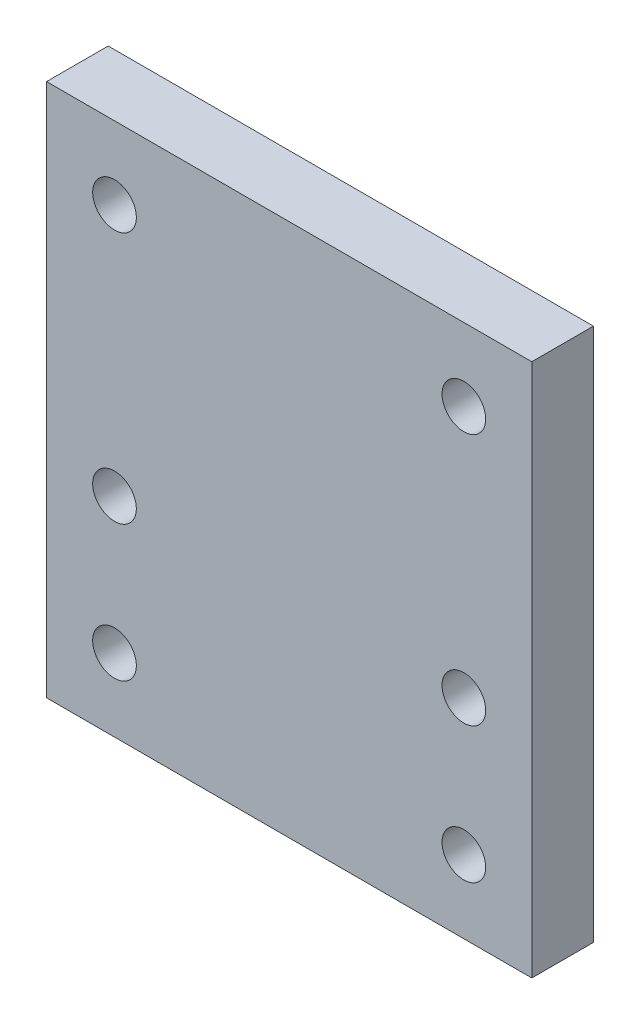
ISO-10303-21;
HEADER;
FILE_DESCRIPTION(('STEP AP214'),'2;1');
FILE_NAME('part.step','',(''),(''),'','','');
FILE_SCHEMA(('AUTOMOTIVE_DESIGN { 1 0 10303 214 1 1 1 1 }'));
ENDSEC;
DATA;
#1=APPLICATION_CONTEXT('core data for automotive mechanical design processes');
#2=APPLICATION_PROTOCOL_DEFINITION('international standard','automotive_design',2000,#1);
#3=PRODUCT_CONTEXT('',#1,'mechanical');
#4=PRODUCT('Part','Part','',(#3));
#5=PRODUCT_RELATED_PRODUCT_CATEGORY('part','',(#4));
#6=PRODUCT_DEFINITION_FORMATION('','',#4);
#7=PRODUCT_DEFINITION_CONTEXT('part definition',#1,'design');
#8=PRODUCT_DEFINITION('design','',#6,#7);
#9=PRODUCT_DEFINITION_SHAPE('','',#8);
#10=(LENGTH_UNIT() NAMED_UNIT(*) SI_UNIT(.MILLI.,.METRE.));
#11=(NAMED_UNIT(*) PLANE_ANGLE_UNIT() SI_UNIT($,.RADIAN.));
#12=(NAMED_UNIT(*) SI_UNIT($,.STERADIAN.) SOLID_ANGLE_UNIT());
#13=UNCERTAINTY_MEASURE_WITH_UNIT(LENGTH_MEASURE(1.E-05),#10,'distance_accuracy_value','');
#14=(GEOMETRIC_REPRESENTATION_CONTEXT(3) GLOBAL_UNCERTAINTY_ASSIGNED_CONTEXT((#13)) GLOBAL_UNIT_ASSIGNED_CONTEXT((#10,
#11,#12)) REPRESENTATION_CONTEXT('',''));
#15=CARTESIAN_POINT('',(0.,0.,0.));
#16=DIRECTION('',(0.,0.,1.));
#17=DIRECTION('',(1.,0.,0.));
#18=AXIS2_PLACEMENT_3D('',#15,#16,#17);
#19=CARTESIAN_POINT('',(0.,0.,12.7));
#20=DIRECTION('',(1.,0.,0.));
#21=DIRECTION('',(0.,0.,-1.));
#22=AXIS2_PLACEMENT_3D('',#19,#20,#21);
#23=PLANE('',#22);
#24=DIRECTION('',(0.,-1.,0.));
#25=VECTOR('',#24,1.);
#26=CARTESIAN_POINT('',(0.,0.,0.));
#27=LINE('',#26,#25);
#28=CARTESIAN_POINT('',(0.,110.,0.));
#29=VERTEX_POINT('',#28);
#30=CARTESIAN_POINT('',(0.,0.,0.));
#31=VERTEX_POINT('',#30);
#32=EDGE_CURVE('E99',#29,#31,#27,.T.);
#33=ORIENTED_EDGE('',*,*,#32,.T.);
#34=DIRECTION('',(0.,0.,-1.));
#35=VECTOR('',#34,1.);
#36=CARTESIAN_POINT('',(0.,0.,12.7));
#37=LINE('',#36,#35);
#38=CARTESIAN_POINT('',(0.,0.,12.7));
#39=VERTEX_POINT('',#38);
#40=EDGE_CURVE('E11',#39,#31,#37,.T.);
#41=ORIENTED_EDGE('',*,*,#40,.F.);
#42=DIRECTION('',(0.,-1.,0.));
#43=VECTOR('',#42,1.);
#44=CARTESIAN_POINT('',(0.,0.,12.7));
#45=LINE('',#44,#43);
#46=CARTESIAN_POINT('',(0.,110.,12.7));
#47=VERTEX_POINT('',#46);
#48=EDGE_CURVE('E87',#47,#39,#45,.T.);
#49=ORIENTED_EDGE('',*,*,#48,.F.);
#50=DIRECTION('',(0.,0.,-1.));
#51=VECTOR('',#50,1.);
#52=CARTESIAN_POINT('',(0.,110.,12.7));
#53=LINE('',#52,#51);
#54=EDGE_CURVE('E95',#47,#29,#53,.T.);
#55=ORIENTED_EDGE('',*,*,#54,.T.);
#56=EDGE_LOOP('',(#33,#41,#49,#55));
#57=FACE_BOUND('',#56,.T.);
#58=ADVANCED_FACE('F36',(#57),#23,.F.);
#59=CARTESIAN_POINT('',(0.,0.,12.7));
#60=DIRECTION('',(0.,1.,0.));
#61=DIRECTION('',(0.,0.,1.));
#62=AXIS2_PLACEMENT_3D('',#59,#60,#61);
#63=PLANE('',#62);
#64=DIRECTION('',(1.,0.,0.));
#65=VECTOR('',#64,1.);
#66=CARTESIAN_POINT('',(0.,0.,0.));
#67=LINE('',#66,#65);
#68=CARTESIAN_POINT('',(100.,0.,0.));
#69=VERTEX_POINT('',#68);
#70=EDGE_CURVE('E91',#31,#69,#67,.T.);
#71=ORIENTED_EDGE('',*,*,#70,.T.);
#72=DIRECTION('',(0.,0.,-1.));
#73=VECTOR('',#72,1.);
#74=CARTESIAN_POINT('',(100.,0.,12.7));
#75=LINE('',#74,#73);
#76=CARTESIAN_POINT('',(100.,0.,12.7));
#77=VERTEX_POINT('',#76);
#78=EDGE_CURVE('E44',#77,#69,#75,.T.);
#79=ORIENTED_EDGE('',*,*,#78,.F.);
#80=DIRECTION('',(1.,0.,0.));
#81=VECTOR('',#80,1.);
#82=CARTESIAN_POINT('',(0.,0.,12.7));
#83=LINE('',#82,#81);
#84=EDGE_CURVE('E82',#39,#77,#83,.T.);
#85=ORIENTED_EDGE('',*,*,#84,.F.);
#86=ORIENTED_EDGE('',*,*,#40,.T.);
#87=EDGE_LOOP('',(#71,#79,#85,#86));
#88=FACE_BOUND('',#87,.T.);
#89=ADVANCED_FACE('F90',(#88),#63,.F.);
#90=CARTESIAN_POINT('',(100.,0.,12.7));
#91=DIRECTION('',(-1.,0.,0.));
#92=DIRECTION('',(0.,0.,1.));
#93=AXIS2_PLACEMENT_3D('',#90,#91,#92);
#94=PLANE('',#93);
#95=DIRECTION('',(0.,1.,0.));
#96=VECTOR('',#95,1.);
#97=CARTESIAN_POINT('',(100.,0.,0.));
#98=LINE('',#97,#96);
#99=CARTESIAN_POINT('',(100.,110.,0.));
#100=VERTEX_POINT('',#99);
#101=EDGE_CURVE('E69',#69,#100,#98,.T.);
#102=ORIENTED_EDGE('',*,*,#101,.T.);
#103=DIRECTION('',(0.,0.,-1.));
#104=VECTOR('',#103,1.);
#105=CARTESIAN_POINT('',(100.,110.,12.7));
#106=LINE('',#105,#104);
#107=CARTESIAN_POINT('',(100.,110.,12.7));
#108=VERTEX_POINT('',#107);
#109=EDGE_CURVE('E92',#108,#100,#106,.T.);
#110=ORIENTED_EDGE('',*,*,#109,.F.);
#111=DIRECTION('',(0.,1.,0.));
#112=VECTOR('',#111,1.);
#113=CARTESIAN_POINT('',(100.,0.,12.7));
#114=LINE('',#113,#112);
#115=EDGE_CURVE('E85',#77,#108,#114,.T.);
#116=ORIENTED_EDGE('',*,*,#115,.F.);
#117=ORIENTED_EDGE('',*,*,#78,.T.);
#118=EDGE_LOOP('',(#102,#110,#116,#117));
#119=FACE_BOUND('',#118,.T.);
#120=ADVANCED_FACE('F93',(#119),#94,.F.);
#121=CARTESIAN_POINT('',(0.,110.,12.7));
#122=DIRECTION('',(0.,-1.,0.));
#123=DIRECTION('',(0.,0.,-1.));
#124=AXIS2_PLACEMENT_3D('',#121,#122,#123);
#125=PLANE('',#124);
#126=DIRECTION('',(-1.,0.,0.));
#127=VECTOR('',#126,1.);
#128=CARTESIAN_POINT('',(0.,110.,0.));
#129=LINE('',#128,#127);
#130=EDGE_CURVE('E75',#100,#29,#129,.T.);
#131=ORIENTED_EDGE('',*,*,#130,.T.);
#132=ORIENTED_EDGE('',*,*,#54,.F.);
#133=DIRECTION('',(-1.,0.,0.));
#134=VECTOR('',#133,1.);
#135=CARTESIAN_POINT('',(0.,110.,12.7));
#136=LINE('',#135,#134);
#137=EDGE_CURVE('E52',#108,#47,#136,.T.);
#138=ORIENTED_EDGE('',*,*,#137,.F.);
#139=ORIENTED_EDGE('',*,*,#109,.T.);
#140=EDGE_LOOP('',(#131,#132,#138,#139));
#141=FACE_BOUND('',#140,.T.);
#142=ADVANCED_FACE('F107',(#141),#125,.F.);
#143=CARTESIAN_POINT('',(0.,0.,12.7));
#144=DIRECTION('',(0.,0.,-1.));
#145=DIRECTION('',(-1.,0.,0.));
#146=AXIS2_PLACEMENT_3D('',#143,#144,#145);
#147=PLANE('',#146);
#148=CARTESIAN_POINT('',(86.0000000000001,94.9999999999999,12.7));
#149=DIRECTION('',(0.,0.,1.));
#150=DIRECTION('',(1.,0.,0.));
#151=AXIS2_PLACEMENT_3D('',#148,#149,#150);
#152=CIRCLE('',#151,4.50000000000002);
#153=CARTESIAN_POINT('',(90.5000000000001,94.9999999999999,12.7));
#154=VERTEX_POINT('',#153);
#155=EDGE_CURVE('E118',#154,#154,#152,.T.);
#156=ORIENTED_EDGE('',*,*,#155,.F.);
#157=EDGE_LOOP('',(#156));
#158=FACE_BOUND('',#157,.T.);
#159=CARTESIAN_POINT('',(14.0000000000002,95.,12.7));
#160=DIRECTION('',(0.,0.,1.));
#161=DIRECTION('',(1.,0.,0.));
#162=AXIS2_PLACEMENT_3D('',#159,#160,#161);
#163=CIRCLE('',#162,4.50000000000003);
#164=CARTESIAN_POINT('',(18.5000000000002,95.,12.7));
#165=VERTEX_POINT('',#164);
#166=EDGE_CURVE('E133',#165,#165,#163,.T.);
#167=ORIENTED_EDGE('',*,*,#166,.F.);
#168=EDGE_LOOP('',(#167));
#169=FACE_BOUND('',#168,.T.);
#170=CARTESIAN_POINT('',(14.0000000000001,42.9999999999999,12.7));
#171=DIRECTION('',(0.,0.,1.));
#172=DIRECTION('',(1.,0.,0.));
#173=AXIS2_PLACEMENT_3D('',#170,#171,#172);
#174=CIRCLE('',#173,4.50000000000002);
#175=CARTESIAN_POINT('',(18.5000000000001,42.9999999999999,12.7));
#176=VERTEX_POINT('',#175);
#177=EDGE_CURVE('E127',#176,#176,#174,.T.);
#178=ORIENTED_EDGE('',*,*,#177,.F.);
#179=EDGE_LOOP('',(#178));
#180=FACE_BOUND('',#179,.T.);
#181=CARTESIAN_POINT('',(86.,15.,12.7));
#182=DIRECTION('',(0.,0.,1.));
#183=DIRECTION('',(1.,0.,0.));
#184=AXIS2_PLACEMENT_3D('',#181,#182,#183);
#185=CIRCLE('',#184,4.5);
#186=CARTESIAN_POINT('',(90.5,15.,12.7));
#187=VERTEX_POINT('',#186);
#188=EDGE_CURVE('E119',#187,#187,#185,.T.);
#189=ORIENTED_EDGE('',*,*,#188,.F.);
#190=EDGE_LOOP('',(#189));
#191=FACE_BOUND('',#190,.T.);
#192=CARTESIAN_POINT('',(14.,15.,12.7));
#193=DIRECTION('',(0.,0.,1.));
#194=DIRECTION('',(1.,0.,0.));
#195=AXIS2_PLACEMENT_3D('',#192,#193,#194);
#196=CIRCLE('',#195,4.5);
#197=CARTESIAN_POINT('',(18.5,15.,12.7));
#198=VERTEX_POINT('',#197);
#199=EDGE_CURVE('E126',#198,#198,#196,.T.);
#200=ORIENTED_EDGE('',*,*,#199,.F.);
#201=EDGE_LOOP('',(#200));
#202=FACE_BOUND('',#201,.T.);
#203=CARTESIAN_POINT('',(85.9999999999998,42.9999999999998,12.7));
#204=DIRECTION('',(0.,0.,1.));
#205=DIRECTION('',(1.,0.,0.));
#206=AXIS2_PLACEMENT_3D('',#203,#204,#205);
#207=CIRCLE('',#206,4.49999999999999);
#208=CARTESIAN_POINT('',(90.4999999999998,42.9999999999998,12.7));
#209=VERTEX_POINT('',#208);
#210=EDGE_CURVE('E115',#209,#209,#207,.T.);
#211=ORIENTED_EDGE('',*,*,#210,.F.);
#212=EDGE_LOOP('',(#211));
#213=FACE_BOUND('',#212,.T.);
#214=ORIENTED_EDGE('',*,*,#48,.T.);
#215=ORIENTED_EDGE('',*,*,#84,.T.);
#216=ORIENTED_EDGE('',*,*,#115,.T.);
#217=ORIENTED_EDGE('',*,*,#137,.T.);
#218=EDGE_LOOP('',(#214,#215,#216,#217));
#219=FACE_BOUND('',#218,.T.);
#220=ADVANCED_FACE('F83',(#158,#169,#180,#191,#202,#213,#219),#147,.F.);
#221=CARTESIAN_POINT('',(0.,0.,0.));
#222=DIRECTION('',(0.,0.,-1.));
#223=DIRECTION('',(-1.,0.,0.));
#224=AXIS2_PLACEMENT_3D('',#221,#222,#223);
#225=PLANE('',#224);
#226=CARTESIAN_POINT('',(86.0000000000001,94.9999999999999,0.));
#227=DIRECTION('',(0.,0.,-1.));
#228=DIRECTION('',(-1.,0.,0.));
#229=AXIS2_PLACEMENT_3D('',#226,#227,#228);
#230=CIRCLE('',#229,4.50000000000002);
#231=CARTESIAN_POINT('',(81.5000000000001,94.9999999999999,0.));
#232=VERTEX_POINT('',#231);
#233=EDGE_CURVE('E136',#232,#232,#230,.F.);
#234=ORIENTED_EDGE('',*,*,#233,.T.);
#235=EDGE_LOOP('',(#234));
#236=FACE_BOUND('',#235,.T.);
#237=CARTESIAN_POINT('',(14.0000000000002,95.,0.));
#238=DIRECTION('',(0.,0.,-1.));
#239=DIRECTION('',(-1.,0.,0.));
#240=AXIS2_PLACEMENT_3D('',#237,#238,#239);
#241=CIRCLE('',#240,4.50000000000003);
#242=CARTESIAN_POINT('',(9.50000000000016,95.,0.));
#243=VERTEX_POINT('',#242);
#244=EDGE_CURVE('E130',#243,#243,#241,.F.);
#245=ORIENTED_EDGE('',*,*,#244,.T.);
#246=EDGE_LOOP('',(#245));
#247=FACE_BOUND('',#246,.T.);
#248=CARTESIAN_POINT('',(14.0000000000001,42.9999999999999,0.));
#249=DIRECTION('',(0.,0.,-1.));
#250=DIRECTION('',(-1.,0.,0.));
#251=AXIS2_PLACEMENT_3D('',#248,#249,#250);
#252=CIRCLE('',#251,4.50000000000002);
#253=CARTESIAN_POINT('',(9.50000000000007,42.9999999999999,0.));
#254=VERTEX_POINT('',#253);
#255=EDGE_CURVE('E122',#254,#254,#252,.F.);
#256=ORIENTED_EDGE('',*,*,#255,.T.);
#257=EDGE_LOOP('',(#256));
#258=FACE_BOUND('',#257,.T.);
#259=CARTESIAN_POINT('',(86.,15.,0.));
#260=DIRECTION('',(0.,0.,-1.));
#261=DIRECTION('',(-1.,0.,0.));
#262=AXIS2_PLACEMENT_3D('',#259,#260,#261);
#263=CIRCLE('',#262,4.5);
#264=CARTESIAN_POINT('',(81.5,15.,0.));
#265=VERTEX_POINT('',#264);
#266=EDGE_CURVE('E123',#265,#265,#263,.F.);
#267=ORIENTED_EDGE('',*,*,#266,.T.);
#268=EDGE_LOOP('',(#267));
#269=FACE_BOUND('',#268,.T.);
#270=CARTESIAN_POINT('',(14.,15.,0.));
#271=DIRECTION('',(0.,0.,-1.));
#272=DIRECTION('',(-1.,0.,0.));
#273=AXIS2_PLACEMENT_3D('',#270,#271,#272);
#274=CIRCLE('',#273,4.5);
#275=CARTESIAN_POINT('',(9.5,15.,0.));
#276=VERTEX_POINT('',#275);
#277=EDGE_CURVE('E145',#276,#276,#274,.F.);
#278=ORIENTED_EDGE('',*,*,#277,.T.);
#279=EDGE_LOOP('',(#278));
#280=FACE_BOUND('',#279,.T.);
#281=CARTESIAN_POINT('',(85.9999999999998,42.9999999999998,0.));
#282=DIRECTION('',(0.,0.,-1.));
#283=DIRECTION('',(-1.,0.,0.));
#284=AXIS2_PLACEMENT_3D('',#281,#282,#283);
#285=CIRCLE('',#284,4.49999999999999);
#286=CARTESIAN_POINT('',(81.4999999999998,42.9999999999998,0.));
#287=VERTEX_POINT('',#286);
#288=EDGE_CURVE('E102',#287,#287,#285,.F.);
#289=ORIENTED_EDGE('',*,*,#288,.T.);
#290=EDGE_LOOP('',(#289));
#291=FACE_BOUND('',#290,.T.);
#292=ORIENTED_EDGE('',*,*,#32,.F.);
#293=ORIENTED_EDGE('',*,*,#130,.F.);
#294=ORIENTED_EDGE('',*,*,#101,.F.);
#295=ORIENTED_EDGE('',*,*,#70,.F.);
#296=EDGE_LOOP('',(#292,#293,#294,#295));
#297=FACE_BOUND('',#296,.T.);
#298=ADVANCED_FACE('F110',(#236,#247,#258,#269,#280,#291,#297),#225,.T.);
#299=CARTESIAN_POINT('',(85.9999999999998,42.9999999999998,-12.727922061358));
#300=DIRECTION('',(0.,0.,1.));
#301=DIRECTION('',(1.,0.,0.));
#302=AXIS2_PLACEMENT_3D('',#299,#300,#301);
#303=CYLINDRICAL_SURFACE('',#302,4.49999999999999);
#304=ORIENTED_EDGE('',*,*,#210,.T.);
#305=EDGE_LOOP('',(#304));
#306=FACE_BOUND('',#305,.T.);
#307=ORIENTED_EDGE('',*,*,#288,.F.);
#308=EDGE_LOOP('',(#307));
#309=FACE_BOUND('',#308,.T.);
#310=ADVANCED_FACE('F154',(#306,#309),#303,.F.);
#311=CARTESIAN_POINT('',(14.,15.,-12.727922061358));
#312=DIRECTION('',(0.,0.,1.));
#313=DIRECTION('',(1.,0.,0.));
#314=AXIS2_PLACEMENT_3D('',#311,#312,#313);
#315=CYLINDRICAL_SURFACE('',#314,4.5);
#316=ORIENTED_EDGE('',*,*,#199,.T.);
#317=EDGE_LOOP('',(#316));
#318=FACE_BOUND('',#317,.T.);
#319=ORIENTED_EDGE('',*,*,#277,.F.);
#320=EDGE_LOOP('',(#319));
#321=FACE_BOUND('',#320,.T.);
#322=ADVANCED_FACE('F151',(#318,#321),#315,.F.);
#323=CARTESIAN_POINT('',(86.,15.,-12.727922061358));
#324=DIRECTION('',(0.,0.,1.));
#325=DIRECTION('',(1.,0.,0.));
#326=AXIS2_PLACEMENT_3D('',#323,#324,#325);
#327=CYLINDRICAL_SURFACE('',#326,4.5);
#328=ORIENTED_EDGE('',*,*,#188,.T.);
#329=EDGE_LOOP('',(#328));
#330=FACE_BOUND('',#329,.T.);
#331=ORIENTED_EDGE('',*,*,#266,.F.);
#332=EDGE_LOOP('',(#331));
#333=FACE_BOUND('',#332,.T.);
#334=ADVANCED_FACE('F153',(#330,#333),#327,.F.);
#335=CARTESIAN_POINT('',(14.0000000000001,42.9999999999999,-12.727922061358));
#336=DIRECTION('',(0.,0.,1.));
#337=DIRECTION('',(1.,0.,0.));
#338=AXIS2_PLACEMENT_3D('',#335,#336,#337);
#339=CYLINDRICAL_SURFACE('',#338,4.50000000000002);
#340=ORIENTED_EDGE('',*,*,#177,.T.);
#341=EDGE_LOOP('',(#340));
#342=FACE_BOUND('',#341,.T.);
#343=ORIENTED_EDGE('',*,*,#255,.F.);
#344=EDGE_LOOP('',(#343));
#345=FACE_BOUND('',#344,.T.);
#346=ADVANCED_FACE('F161',(#342,#345),#339,.F.);
#347=CARTESIAN_POINT('',(14.0000000000002,95.,-12.727922061358));
#348=DIRECTION('',(0.,0.,1.));
#349=DIRECTION('',(1.,0.,0.));
#350=AXIS2_PLACEMENT_3D('',#347,#348,#349);
#351=CYLINDRICAL_SURFACE('',#350,4.50000000000003);
#352=ORIENTED_EDGE('',*,*,#166,.T.);
#353=EDGE_LOOP('',(#352));
#354=FACE_BOUND('',#353,.T.);
#355=ORIENTED_EDGE('',*,*,#244,.F.);
#356=EDGE_LOOP('',(#355));
#357=FACE_BOUND('',#356,.T.);
#358=ADVANCED_FACE('F186',(#354,#357),#351,.F.);
#359=CARTESIAN_POINT('',(86.0000000000001,94.9999999999999,-12.727922061358));
#360=DIRECTION('',(0.,0.,1.));
#361=DIRECTION('',(1.,0.,0.));
#362=AXIS2_PLACEMENT_3D('',#359,#360,#361);
#363=CYLINDRICAL_SURFACE('',#362,4.50000000000002);
#364=ORIENTED_EDGE('',*,*,#155,.T.);
#365=EDGE_LOOP('',(#364));
#366=FACE_BOUND('',#365,.T.);
#367=ORIENTED_EDGE('',*,*,#233,.F.);
#368=EDGE_LOOP('',(#367));
#369=FACE_BOUND('',#368,.T.);
#370=ADVANCED_FACE('F189',(#366,#369),#363,.F.);
#371=CLOSED_SHELL('',(#58,#89,#120,#142,#220,#298,#310,#322,#334,#346,#358,#370));
#372=MANIFOLD_SOLID_BREP('B2',#371);
#373=ADVANCED_BREP_SHAPE_REPRESENTATION('',(#18,#372),#14);
#374=SHAPE_DEFINITION_REPRESENTATION(#9,#373);
ENDSEC;
END-ISO-10303-21;
